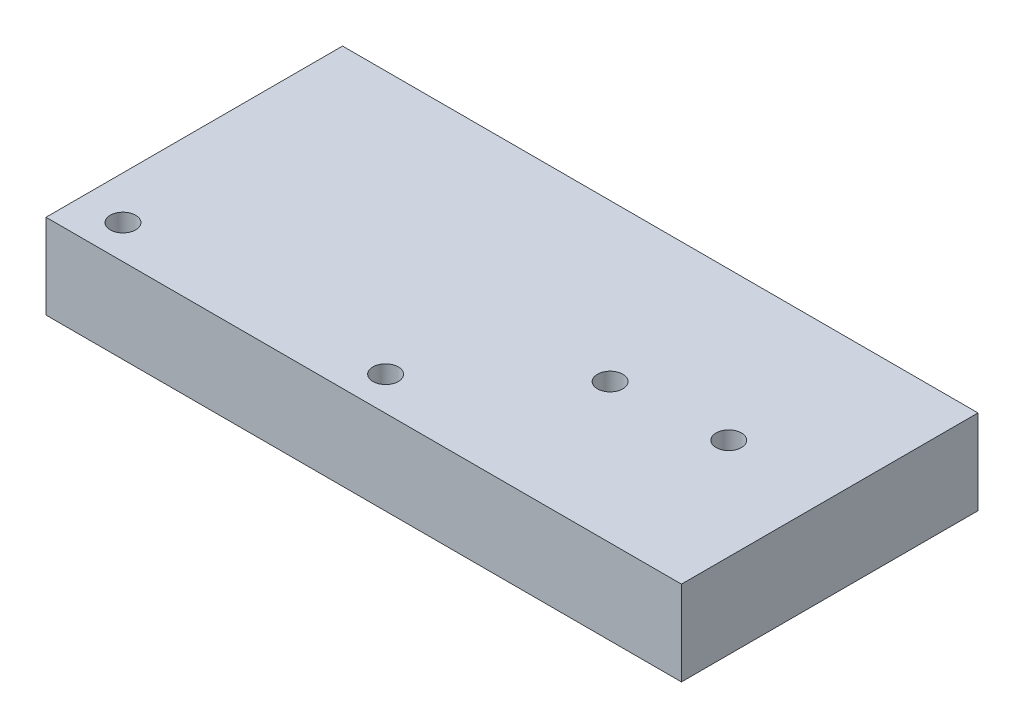
ISO-10303-21;
HEADER;
FILE_DESCRIPTION(('STEP AP214'),'2;1');
FILE_NAME('part.step','',(''),(''),'','','');
FILE_SCHEMA(('AUTOMOTIVE_DESIGN { 1 0 10303 214 1 1 1 1 }'));
ENDSEC;
DATA;
#1=APPLICATION_CONTEXT('core data for automotive mechanical design processes');
#2=APPLICATION_PROTOCOL_DEFINITION('international standard','automotive_design',2000,#1);
#3=PRODUCT_CONTEXT('',#1,'mechanical');
#4=PRODUCT('Part','Part','',(#3));
#5=PRODUCT_RELATED_PRODUCT_CATEGORY('part','',(#4));
#6=PRODUCT_DEFINITION_FORMATION('','',#4);
#7=PRODUCT_DEFINITION_CONTEXT('part definition',#1,'design');
#8=PRODUCT_DEFINITION('design','',#6,#7);
#9=PRODUCT_DEFINITION_SHAPE('','',#8);
#10=(LENGTH_UNIT() NAMED_UNIT(*) SI_UNIT(.MILLI.,.METRE.));
#11=(NAMED_UNIT(*) PLANE_ANGLE_UNIT() SI_UNIT($,.RADIAN.));
#12=(NAMED_UNIT(*) SI_UNIT($,.STERADIAN.) SOLID_ANGLE_UNIT());
#13=UNCERTAINTY_MEASURE_WITH_UNIT(LENGTH_MEASURE(1.E-05),#10,'distance_accuracy_value','');
#14=(GEOMETRIC_REPRESENTATION_CONTEXT(3) GLOBAL_UNCERTAINTY_ASSIGNED_CONTEXT((#13)) GLOBAL_UNIT_ASSIGNED_CONTEXT((#10,
#11,#12)) REPRESENTATION_CONTEXT('',''));
#15=CARTESIAN_POINT('',(0.,0.,0.));
#16=DIRECTION('',(0.,0.,1.));
#17=DIRECTION('',(1.,0.,0.));
#18=AXIS2_PLACEMENT_3D('',#15,#16,#17);
#19=CARTESIAN_POINT('',(-75.,10.,-35.));
#20=DIRECTION('',(1.,0.,0.));
#21=DIRECTION('',(0.,0.,-1.));
#22=AXIS2_PLACEMENT_3D('',#19,#20,#21);
#23=PLANE('',#22);
#24=DIRECTION('',(0.,0.,1.));
#25=VECTOR('',#24,1.);
#26=CARTESIAN_POINT('',(-75.,-10.,-35.));
#27=LINE('',#26,#25);
#28=CARTESIAN_POINT('',(-75.,-10.,-35.));
#29=VERTEX_POINT('',#28);
#30=CARTESIAN_POINT('',(-75.,-10.,35.));
#31=VERTEX_POINT('',#30);
#32=EDGE_CURVE('E95',#29,#31,#27,.T.);
#33=ORIENTED_EDGE('',*,*,#32,.T.);
#34=DIRECTION('',(0.,-1.,0.));
#35=VECTOR('',#34,1.);
#36=CARTESIAN_POINT('',(-75.,10.,35.));
#37=LINE('',#36,#35);
#38=CARTESIAN_POINT('',(-75.,10.,35.));
#39=VERTEX_POINT('',#38);
#40=EDGE_CURVE('E11',#39,#31,#37,.T.);
#41=ORIENTED_EDGE('',*,*,#40,.F.);
#42=DIRECTION('',(0.,0.,1.));
#43=VECTOR('',#42,1.);
#44=CARTESIAN_POINT('',(-75.,10.,-35.));
#45=LINE('',#44,#43);
#46=CARTESIAN_POINT('',(-75.,10.,-35.));
#47=VERTEX_POINT('',#46);
#48=EDGE_CURVE('E83',#47,#39,#45,.T.);
#49=ORIENTED_EDGE('',*,*,#48,.F.);
#50=DIRECTION('',(0.,-1.,0.));
#51=VECTOR('',#50,1.);
#52=CARTESIAN_POINT('',(-75.,10.,-35.));
#53=LINE('',#52,#51);
#54=EDGE_CURVE('E91',#47,#29,#53,.T.);
#55=ORIENTED_EDGE('',*,*,#54,.T.);
#56=EDGE_LOOP('',(#33,#41,#49,#55));
#57=FACE_BOUND('',#56,.T.);
#58=ADVANCED_FACE('F32',(#57),#23,.F.);
#59=CARTESIAN_POINT('',(75.,10.,35.));
#60=DIRECTION('',(0.,0.,-1.));
#61=DIRECTION('',(-1.,0.,0.));
#62=AXIS2_PLACEMENT_3D('',#59,#60,#61);
#63=PLANE('',#62);
#64=DIRECTION('',(1.,0.,0.));
#65=VECTOR('',#64,1.);
#66=CARTESIAN_POINT('',(75.,-10.,35.));
#67=LINE('',#66,#65);
#68=CARTESIAN_POINT('',(75.,-10.,35.));
#69=VERTEX_POINT('',#68);
#70=EDGE_CURVE('E87',#31,#69,#67,.T.);
#71=ORIENTED_EDGE('',*,*,#70,.T.);
#72=DIRECTION('',(0.,-1.,0.));
#73=VECTOR('',#72,1.);
#74=CARTESIAN_POINT('',(75.,10.,35.));
#75=LINE('',#74,#73);
#76=CARTESIAN_POINT('',(75.,10.,35.));
#77=VERTEX_POINT('',#76);
#78=EDGE_CURVE('E40',#77,#69,#75,.T.);
#79=ORIENTED_EDGE('',*,*,#78,.F.);
#80=DIRECTION('',(1.,0.,0.));
#81=VECTOR('',#80,1.);
#82=CARTESIAN_POINT('',(75.,10.,35.));
#83=LINE('',#82,#81);
#84=EDGE_CURVE('E78',#39,#77,#83,.T.);
#85=ORIENTED_EDGE('',*,*,#84,.F.);
#86=ORIENTED_EDGE('',*,*,#40,.T.);
#87=EDGE_LOOP('',(#71,#79,#85,#86));
#88=FACE_BOUND('',#87,.T.);
#89=ADVANCED_FACE('F86',(#88),#63,.F.);
#90=CARTESIAN_POINT('',(75.,10.,-35.));
#91=DIRECTION('',(-1.,0.,0.));
#92=DIRECTION('',(0.,0.,1.));
#93=AXIS2_PLACEMENT_3D('',#90,#91,#92);
#94=PLANE('',#93);
#95=DIRECTION('',(0.,0.,-1.));
#96=VECTOR('',#95,1.);
#97=CARTESIAN_POINT('',(75.,-10.,-35.));
#98=LINE('',#97,#96);
#99=CARTESIAN_POINT('',(75.,-10.,-35.));
#100=VERTEX_POINT('',#99);
#101=EDGE_CURVE('E65',#69,#100,#98,.T.);
#102=ORIENTED_EDGE('',*,*,#101,.T.);
#103=DIRECTION('',(0.,-1.,0.));
#104=VECTOR('',#103,1.);
#105=CARTESIAN_POINT('',(75.,10.,-35.));
#106=LINE('',#105,#104);
#107=CARTESIAN_POINT('',(75.,10.,-35.));
#108=VERTEX_POINT('',#107);
#109=EDGE_CURVE('E88',#108,#100,#106,.T.);
#110=ORIENTED_EDGE('',*,*,#109,.F.);
#111=DIRECTION('',(0.,0.,-1.));
#112=VECTOR('',#111,1.);
#113=CARTESIAN_POINT('',(75.,10.,-35.));
#114=LINE('',#113,#112);
#115=EDGE_CURVE('E81',#77,#108,#114,.T.);
#116=ORIENTED_EDGE('',*,*,#115,.F.);
#117=ORIENTED_EDGE('',*,*,#78,.T.);
#118=EDGE_LOOP('',(#102,#110,#116,#117));
#119=FACE_BOUND('',#118,.T.);
#120=ADVANCED_FACE('F89',(#119),#94,.F.);
#121=CARTESIAN_POINT('',(75.,10.,-35.));
#122=DIRECTION('',(0.,0.,1.));
#123=DIRECTION('',(1.,0.,0.));
#124=AXIS2_PLACEMENT_3D('',#121,#122,#123);
#125=PLANE('',#124);
#126=DIRECTION('',(-1.,0.,0.));
#127=VECTOR('',#126,1.);
#128=CARTESIAN_POINT('',(75.,-10.,-35.));
#129=LINE('',#128,#127);
#130=EDGE_CURVE('E71',#100,#29,#129,.T.);
#131=ORIENTED_EDGE('',*,*,#130,.T.);
#132=ORIENTED_EDGE('',*,*,#54,.F.);
#133=DIRECTION('',(-1.,0.,0.));
#134=VECTOR('',#133,1.);
#135=CARTESIAN_POINT('',(75.,10.,-35.));
#136=LINE('',#135,#134);
#137=EDGE_CURVE('E48',#108,#47,#136,.T.);
#138=ORIENTED_EDGE('',*,*,#137,.F.);
#139=ORIENTED_EDGE('',*,*,#109,.T.);
#140=EDGE_LOOP('',(#131,#132,#138,#139));
#141=FACE_BOUND('',#140,.T.);
#142=ADVANCED_FACE('F103',(#141),#125,.F.);
#143=CARTESIAN_POINT('',(0.,10.,0.));
#144=DIRECTION('',(0.,-1.,0.));
#145=DIRECTION('',(0.,0.,-1.));
#146=AXIS2_PLACEMENT_3D('',#143,#144,#145);
#147=PLANE('',#146);
#148=CARTESIAN_POINT('',(51.1693590719876,10.,0.));
#149=DIRECTION('',(0.,1.,0.));
#150=DIRECTION('',(0.,0.,1.));
#151=AXIS2_PLACEMENT_3D('',#148,#149,#150);
#152=CIRCLE('',#151,3.);
#153=CARTESIAN_POINT('',(51.1693590719876,10.,3.));
#154=VERTEX_POINT('',#153);
#155=EDGE_CURVE('E127',#154,#154,#152,.T.);
#156=ORIENTED_EDGE('',*,*,#155,.F.);
#157=EDGE_LOOP('',(#156));
#158=FACE_BOUND('',#157,.T.);
#159=CARTESIAN_POINT('',(25.1693590719876,10.,2.00000000000001));
#160=DIRECTION('',(0.,1.,0.));
#161=DIRECTION('',(0.,0.,1.));
#162=AXIS2_PLACEMENT_3D('',#159,#160,#161);
#163=CIRCLE('',#162,3.);
#164=CARTESIAN_POINT('',(25.1693590719876,10.,5.00000000000001));
#165=VERTEX_POINT('',#164);
#166=EDGE_CURVE('E121',#165,#165,#163,.T.);
#167=ORIENTED_EDGE('',*,*,#166,.F.);
#168=EDGE_LOOP('',(#167));
#169=FACE_BOUND('',#168,.T.);
#170=CARTESIAN_POINT('',(-2.83064092801243,10.,27.));
#171=DIRECTION('',(0.,1.,0.));
#172=DIRECTION('',(0.,0.,1.));
#173=AXIS2_PLACEMENT_3D('',#170,#171,#172);
#174=CIRCLE('',#173,3.);
#175=CARTESIAN_POINT('',(-2.83064092801243,10.,30.));
#176=VERTEX_POINT('',#175);
#177=EDGE_CURVE('E115',#176,#176,#174,.T.);
#178=ORIENTED_EDGE('',*,*,#177,.F.);
#179=EDGE_LOOP('',(#178));
#180=FACE_BOUND('',#179,.T.);
#181=CARTESIAN_POINT('',(-64.8306409280124,10.,27.));
#182=DIRECTION('',(0.,1.,0.));
#183=DIRECTION('',(0.,0.,1.));
#184=AXIS2_PLACEMENT_3D('',#181,#182,#183);
#185=CIRCLE('',#184,3.);
#186=CARTESIAN_POINT('',(-64.8306409280124,10.,30.));
#187=VERTEX_POINT('',#186);
#188=EDGE_CURVE('E109',#187,#187,#185,.T.);
#189=ORIENTED_EDGE('',*,*,#188,.F.);
#190=EDGE_LOOP('',(#189));
#191=FACE_BOUND('',#190,.T.);
#192=ORIENTED_EDGE('',*,*,#48,.T.);
#193=ORIENTED_EDGE('',*,*,#84,.T.);
#194=ORIENTED_EDGE('',*,*,#115,.T.);
#195=ORIENTED_EDGE('',*,*,#137,.T.);
#196=EDGE_LOOP('',(#192,#193,#194,#195));
#197=FACE_BOUND('',#196,.T.);
#198=ADVANCED_FACE('F79',(#158,#169,#180,#191,#197),#147,.F.);
#199=CARTESIAN_POINT('',(0.,-10.,0.));
#200=DIRECTION('',(0.,-1.,0.));
#201=DIRECTION('',(0.,0.,-1.));
#202=AXIS2_PLACEMENT_3D('',#199,#200,#201);
#203=PLANE('',#202);
#204=CARTESIAN_POINT('',(51.1693590719876,-10.,0.));
#205=DIRECTION('',(0.,1.,0.));
#206=DIRECTION('',(0.,0.,1.));
#207=AXIS2_PLACEMENT_3D('',#204,#205,#206);
#208=CIRCLE('',#207,3.);
#209=CARTESIAN_POINT('',(51.1693590719876,-10.,3.));
#210=VERTEX_POINT('',#209);
#211=EDGE_CURVE('E124',#210,#210,#208,.T.);
#212=ORIENTED_EDGE('',*,*,#211,.T.);
#213=EDGE_LOOP('',(#212));
#214=FACE_BOUND('',#213,.T.);
#215=CARTESIAN_POINT('',(25.1693590719876,-10.,2.00000000000001));
#216=DIRECTION('',(0.,1.,0.));
#217=DIRECTION('',(0.,0.,1.));
#218=AXIS2_PLACEMENT_3D('',#215,#216,#217);
#219=CIRCLE('',#218,3.);
#220=CARTESIAN_POINT('',(25.1693590719876,-10.,5.00000000000001));
#221=VERTEX_POINT('',#220);
#222=EDGE_CURVE('E118',#221,#221,#219,.T.);
#223=ORIENTED_EDGE('',*,*,#222,.T.);
#224=EDGE_LOOP('',(#223));
#225=FACE_BOUND('',#224,.T.);
#226=CARTESIAN_POINT('',(-2.83064092801243,-10.,27.));
#227=DIRECTION('',(0.,1.,0.));
#228=DIRECTION('',(0.,0.,1.));
#229=AXIS2_PLACEMENT_3D('',#226,#227,#228);
#230=CIRCLE('',#229,3.);
#231=CARTESIAN_POINT('',(-2.83064092801243,-10.,30.));
#232=VERTEX_POINT('',#231);
#233=EDGE_CURVE('E112',#232,#232,#230,.T.);
#234=ORIENTED_EDGE('',*,*,#233,.T.);
#235=EDGE_LOOP('',(#234));
#236=FACE_BOUND('',#235,.T.);
#237=CARTESIAN_POINT('',(-64.8306409280124,-10.,27.));
#238=DIRECTION('',(0.,1.,0.));
#239=DIRECTION('',(0.,0.,1.));
#240=AXIS2_PLACEMENT_3D('',#237,#238,#239);
#241=CIRCLE('',#240,3.);
#242=CARTESIAN_POINT('',(-64.8306409280124,-10.,30.));
#243=VERTEX_POINT('',#242);
#244=EDGE_CURVE('E98',#243,#243,#241,.T.);
#245=ORIENTED_EDGE('',*,*,#244,.T.);
#246=EDGE_LOOP('',(#245));
#247=FACE_BOUND('',#246,.T.);
#248=ORIENTED_EDGE('',*,*,#32,.F.);
#249=ORIENTED_EDGE('',*,*,#130,.F.);
#250=ORIENTED_EDGE('',*,*,#101,.F.);
#251=ORIENTED_EDGE('',*,*,#70,.F.);
#252=EDGE_LOOP('',(#248,#249,#250,#251));
#253=FACE_BOUND('',#252,.T.);
#254=ADVANCED_FACE('F106',(#214,#225,#236,#247,#253),#203,.T.);
#255=CARTESIAN_POINT('',(-64.8306409280124,-10.,27.));
#256=DIRECTION('',(0.,1.,0.));
#257=DIRECTION('',(0.,0.,1.));
#258=AXIS2_PLACEMENT_3D('',#255,#256,#257);
#259=CYLINDRICAL_SURFACE('',#258,3.);
#260=ORIENTED_EDGE('',*,*,#244,.F.);
#261=EDGE_LOOP('',(#260));
#262=FACE_BOUND('',#261,.T.);
#263=ORIENTED_EDGE('',*,*,#188,.T.);
#264=EDGE_LOOP('',(#263));
#265=FACE_BOUND('',#264,.T.);
#266=ADVANCED_FACE('F151',(#262,#265),#259,.F.);
#267=CARTESIAN_POINT('',(-2.83064092801243,-10.,27.));
#268=DIRECTION('',(0.,1.,0.));
#269=DIRECTION('',(0.,0.,1.));
#270=AXIS2_PLACEMENT_3D('',#267,#268,#269);
#271=CYLINDRICAL_SURFACE('',#270,3.);
#272=ORIENTED_EDGE('',*,*,#233,.F.);
#273=EDGE_LOOP('',(#272));
#274=FACE_BOUND('',#273,.T.);
#275=ORIENTED_EDGE('',*,*,#177,.T.);
#276=EDGE_LOOP('',(#275));
#277=FACE_BOUND('',#276,.T.);
#278=ADVANCED_FACE('F153',(#274,#277),#271,.F.);
#279=CARTESIAN_POINT('',(25.1693590719876,-10.,2.00000000000001));
#280=DIRECTION('',(0.,1.,0.));
#281=DIRECTION('',(0.,0.,1.));
#282=AXIS2_PLACEMENT_3D('',#279,#280,#281);
#283=CYLINDRICAL_SURFACE('',#282,3.);
#284=ORIENTED_EDGE('',*,*,#222,.F.);
#285=EDGE_LOOP('',(#284));
#286=FACE_BOUND('',#285,.T.);
#287=ORIENTED_EDGE('',*,*,#166,.T.);
#288=EDGE_LOOP('',(#287));
#289=FACE_BOUND('',#288,.T.);
#290=ADVANCED_FACE('F138',(#286,#289),#283,.F.);
#291=CARTESIAN_POINT('',(51.1693590719876,-10.,0.));
#292=DIRECTION('',(0.,1.,0.));
#293=DIRECTION('',(0.,0.,1.));
#294=AXIS2_PLACEMENT_3D('',#291,#292,#293);
#295=CYLINDRICAL_SURFACE('',#294,3.);
#296=ORIENTED_EDGE('',*,*,#211,.F.);
#297=EDGE_LOOP('',(#296));
#298=FACE_BOUND('',#297,.T.);
#299=ORIENTED_EDGE('',*,*,#155,.T.);
#300=EDGE_LOOP('',(#299));
#301=FACE_BOUND('',#300,.T.);
#302=ADVANCED_FACE('F135',(#298,#301),#295,.F.);
#303=CLOSED_SHELL('',(#58,#89,#120,#142,#198,#254,#266,#278,#290,#302));
#304=MANIFOLD_SOLID_BREP('B2',#303);
#305=ADVANCED_BREP_SHAPE_REPRESENTATION('',(#18,#304),#14);
#306=SHAPE_DEFINITION_REPRESENTATION(#9,#305);
ENDSEC;
END-ISO-10303-21;
